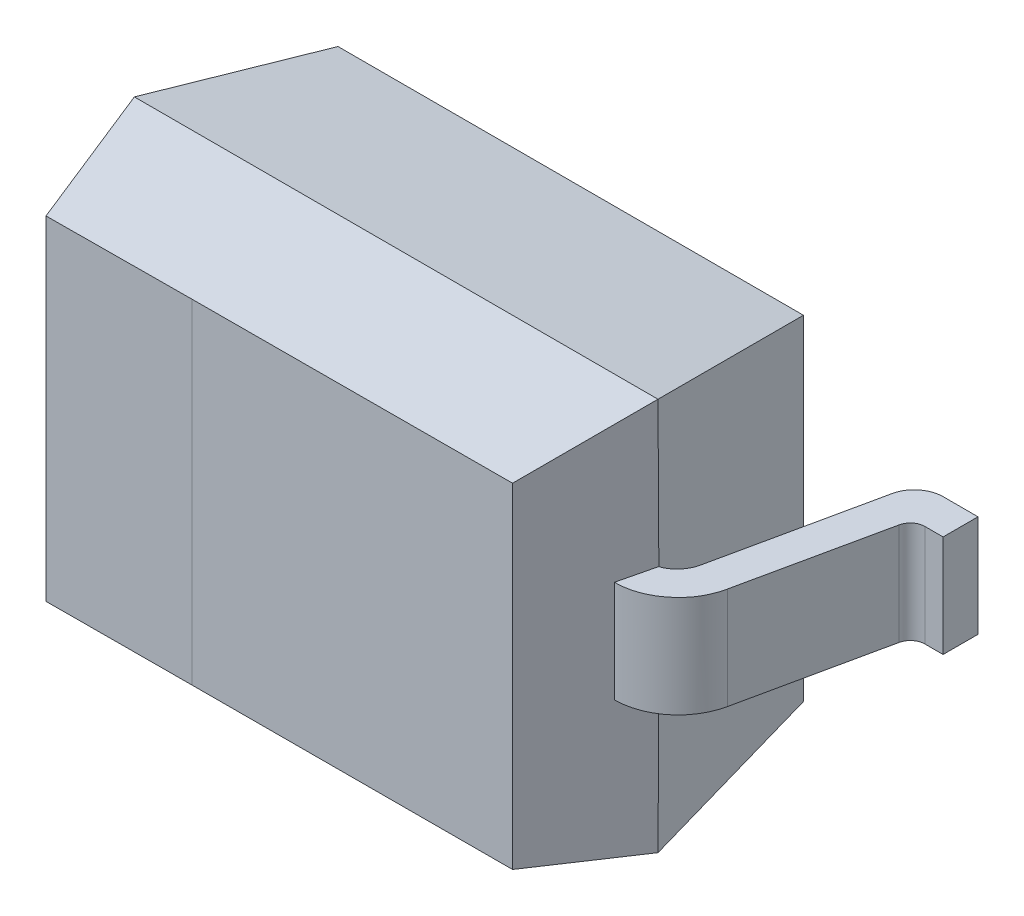
ISO-10303-21;
HEADER;
FILE_DESCRIPTION(('STEP AP214'),'2;1');
FILE_NAME('part.step','',(''),(''),'','','');
FILE_SCHEMA(('AUTOMOTIVE_DESIGN { 1 0 10303 214 1 1 1 1 }'));
ENDSEC;
DATA;
#1=APPLICATION_CONTEXT('core data for automotive mechanical design processes');
#2=APPLICATION_PROTOCOL_DEFINITION('international standard','automotive_design',2000,#1);
#3=PRODUCT_CONTEXT('',#1,'mechanical');
#4=PRODUCT('Part','Part','',(#3));
#5=PRODUCT_RELATED_PRODUCT_CATEGORY('part','',(#4));
#6=PRODUCT_DEFINITION_FORMATION('','',#4);
#7=PRODUCT_DEFINITION_CONTEXT('part definition',#1,'design');
#8=PRODUCT_DEFINITION('design','',#6,#7);
#9=PRODUCT_DEFINITION_SHAPE('','',#8);
#10=(LENGTH_UNIT() NAMED_UNIT(*) SI_UNIT(.MILLI.,.METRE.));
#11=(NAMED_UNIT(*) PLANE_ANGLE_UNIT() SI_UNIT($,.RADIAN.));
#12=(NAMED_UNIT(*) SI_UNIT($,.STERADIAN.) SOLID_ANGLE_UNIT());
#13=UNCERTAINTY_MEASURE_WITH_UNIT(LENGTH_MEASURE(1.E-05),#10,'distance_accuracy_value','');
#14=(GEOMETRIC_REPRESENTATION_CONTEXT(3) GLOBAL_UNCERTAINTY_ASSIGNED_CONTEXT((#13)) GLOBAL_UNIT_ASSIGNED_CONTEXT((#10,
#11,#12)) REPRESENTATION_CONTEXT('',''));
#15=CARTESIAN_POINT('',(0.,0.,0.));
#16=DIRECTION('',(0.,0.,1.));
#17=DIRECTION('',(1.,0.,0.));
#18=AXIS2_PLACEMENT_3D('',#15,#16,#17);
#19=CARTESIAN_POINT('',(0.,-0.543243243287631,-0.0905405405479386));
#20=DIRECTION('',(0.,0.986393923832144,0.164398987305357));
#21=DIRECTION('',(0.,-0.164398987305357,0.986393923832144));
#22=AXIS2_PLACEMENT_3D('',#19,#20,#21);
#23=PLANE('',#22);
#24=DIRECTION('',(1.,0.,0.));
#25=VECTOR('',#24,1.);
#26=CARTESIAN_POINT('',(0.,-0.575000000044477,0.0999999999931353));
#27=LINE('',#26,#25);
#28=CARTESIAN_POINT('',(0.799999999996712,-0.575000000042883,0.0999999999954235));
#29=VERTEX_POINT('',#28);
#30=CARTESIAN_POINT('',(-0.799999999994254,-0.575000000044477,0.0999999999954235));
#31=VERTEX_POINT('',#30);
#32=EDGE_CURVE('E193',#29,#31,#27,.F.);
#33=ORIENTED_EDGE('',*,*,#32,.F.);
#34=DIRECTION('',(-0.16222142136331,0.162221421124477,-0.973328526746865));
#35=VECTOR('',#34,1.);
#36=CARTESIAN_POINT('',(0.900000000150332,-0.67500000005087,0.700000000031497));
#37=LINE('',#36,#35);
#38=CARTESIAN_POINT('',(0.900000000167308,-0.675000000035295,0.700000000057765));
#39=VERTEX_POINT('',#38);
#40=EDGE_CURVE('E197',#39,#29,#37,.T.);
#41=ORIENTED_EDGE('',*,*,#40,.F.);
#42=DIRECTION('',(1.,0.,0.));
#43=VECTOR('',#42,1.);
#44=CARTESIAN_POINT('',(0.,-0.675000000027232,0.700000000025074));
#45=LINE('',#44,#43);
#46=CARTESIAN_POINT('',(-0.900000000136452,-0.675000000034631,0.700000000051428));
#47=VERTEX_POINT('',#46);
#48=EDGE_CURVE('E228',#47,#39,#45,.T.);
#49=ORIENTED_EDGE('',*,*,#48,.F.);
#50=DIRECTION('',(-0.162221421285409,-0.162221421126583,0.973328526759497));
#51=VECTOR('',#50,1.);
#52=CARTESIAN_POINT('',(-0.799999999996712,-0.575000000044876,0.0999999999955346));
#53=LINE('',#52,#51);
#54=EDGE_CURVE('E200',#31,#47,#53,.T.);
#55=ORIENTED_EDGE('',*,*,#54,.F.);
#56=EDGE_LOOP('',(#33,#41,#49,#55));
#57=FACE_BOUND('',#56,.T.);
#58=ADVANCED_FACE('F17',(#57),#23,.F.);
#59=CARTESIAN_POINT('',(-1.180841579,-0.175,0.1));
#60=DIRECTION('',(0.,1.,0.));
#61=DIRECTION('',(0.,0.,1.));
#62=AXIS2_PLACEMENT_3D('',#59,#60,#61);
#63=CYLINDRICAL_SURFACE('',#62,0.0999999996006634);
#64=CARTESIAN_POINT('',(-1.08306133768188,0.175,0.0790470910837952));
#65=CARTESIAN_POINT('',(-1.09038135668443,0.175,0.0448870031683507));
#66=CARTESIAN_POINT('',(-1.11797382468277,0.175,0.0222333914201766));
#67=CARTESIAN_POINT('',(-1.14505445712793,0.175,2.88057883888202E-10));
#68=CARTESIAN_POINT('',(-1.180841579,0.175,1.99668311940716E-10));
#69=B_SPLINE_CURVE_WITH_KNOTS('',2,(#64,#65,#66,#67,#68),.UNSPECIFIED.,.F.,.F.,(3,2,3),(0.,0.5,
1.),.UNSPECIFIED.);
#70=CARTESIAN_POINT('',(-1.08306133762269,0.175,0.0790470910711107));
#71=VERTEX_POINT('',#70);
#72=CARTESIAN_POINT('',(-1.180841579,0.175,1.99668305164453E-10));
#73=VERTEX_POINT('',#72);
#74=EDGE_CURVE('E548',#71,#73,#69,.T.);
#75=ORIENTED_EDGE('',*,*,#74,.F.);
#76=DIRECTION('',(0.,1.,0.));
#77=VECTOR('',#76,1.);
#78=CARTESIAN_POINT('',(-1.08306133713148,0.,0.0790470909658528));
#79=LINE('',#78,#77);
#80=CARTESIAN_POINT('',(-1.0830613376225,-0.175,0.0790470910710698));
#81=VERTEX_POINT('',#80);
#82=EDGE_CURVE('E291',#71,#81,#79,.F.);
#83=ORIENTED_EDGE('',*,*,#82,.T.);
#84=CARTESIAN_POINT('',(-1.180841579,-0.175,0.1));
#85=DIRECTION('',(0.,1.,0.));
#86=DIRECTION('',(0.977802413949725,0.,-0.209529089326732));
#87=AXIS2_PLACEMENT_3D('',#84,#85,#86);
#88=CIRCLE('',#87,0.0999999996006634);
#89=CARTESIAN_POINT('',(-1.180841579,-0.175,1.99473045435386E-10));
#90=VERTEX_POINT('',#89);
#91=EDGE_CURVE('E481',#81,#90,#88,.T.);
#92=ORIENTED_EDGE('',*,*,#91,.T.);
#93=DIRECTION('',(0.,1.,0.));
#94=VECTOR('',#93,1.);
#95=CARTESIAN_POINT('',(-1.180841579,0.,0.));
#96=LINE('',#95,#94);
#97=EDGE_CURVE('E223',#73,#90,#96,.F.);
#98=ORIENTED_EDGE('',*,*,#97,.F.);
#99=EDGE_LOOP('',(#75,#83,#92,#98));
#100=FACE_BOUND('',#99,.T.);
#101=ADVANCED_FACE('F551',(#100),#63,.T.);
#102=CARTESIAN_POINT('',(0.,0.,0.));
#103=DIRECTION('',(0.,0.,-1.));
#104=DIRECTION('',(-1.,0.,0.));
#105=AXIS2_PLACEMENT_3D('',#102,#103,#104);
#106=PLANE('',#105);
#107=DIRECTION('',(1.,0.,0.));
#108=VECTOR('',#107,1.);
#109=CARTESIAN_POINT('',(0.,0.175,1.99668311940716E-10));
#110=LINE('',#109,#108);
#111=CARTESIAN_POINT('',(-1.3,0.175,1.33112207960477E-10));
#112=VERTEX_POINT('',#111);
#113=EDGE_CURVE('E541',#73,#112,#110,.F.);
#114=ORIENTED_EDGE('',*,*,#113,.F.);
#115=ORIENTED_EDGE('',*,*,#97,.T.);
#116=DIRECTION('',(1.,0.,0.));
#117=VECTOR('',#116,1.);
#118=CARTESIAN_POINT('',(0.,-0.175,1.99277792482582E-10));
#119=LINE('',#118,#117);
#120=CARTESIAN_POINT('',(-1.3,-0.175,1.32851861655055E-10));
#121=VERTEX_POINT('',#120);
#122=EDGE_CURVE('E478',#90,#121,#119,.F.);
#123=ORIENTED_EDGE('',*,*,#122,.T.);
#124=DIRECTION('',(0.,1.,0.));
#125=VECTOR('',#124,1.);
#126=CARTESIAN_POINT('',(-1.3,0.,0.));
#127=LINE('',#126,#125);
#128=EDGE_CURVE('E928',#121,#112,#127,.T.);
#129=ORIENTED_EDGE('',*,*,#128,.T.);
#130=EDGE_LOOP('',(#114,#115,#123,#129));
#131=FACE_BOUND('',#130,.T.);
#132=ADVANCED_FACE('F560',(#131),#106,.T.);
#133=CARTESIAN_POINT('',(-1.3,0.,0.));
#134=DIRECTION('',(1.,0.,0.));
#135=DIRECTION('',(0.,0.,-1.));
#136=AXIS2_PLACEMENT_3D('',#133,#134,#135);
#137=PLANE('',#136);
#138=DIRECTION('',(0.,1.,0.));
#139=VECTOR('',#138,1.);
#140=CARTESIAN_POINT('',(-1.3,0.,0.12));
#141=LINE('',#140,#139);
#142=CARTESIAN_POINT('',(-1.3,0.175,0.12));
#143=VERTEX_POINT('',#142);
#144=CARTESIAN_POINT('',(-1.3,-0.175,0.12));
#145=VERTEX_POINT('',#144);
#146=EDGE_CURVE('E931',#143,#145,#141,.F.);
#147=ORIENTED_EDGE('',*,*,#146,.F.);
#148=DIRECTION('',(0.,0.,1.));
#149=VECTOR('',#148,1.);
#150=CARTESIAN_POINT('',(-1.3,0.175,0.));
#151=LINE('',#150,#149);
#152=EDGE_CURVE('E533',#112,#143,#151,.T.);
#153=ORIENTED_EDGE('',*,*,#152,.F.);
#154=ORIENTED_EDGE('',*,*,#128,.F.);
#155=DIRECTION('',(0.,0.,1.));
#156=VECTOR('',#155,1.);
#157=CARTESIAN_POINT('',(-1.3,-0.175,0.));
#158=LINE('',#157,#156);
#159=EDGE_CURVE('E475',#121,#145,#158,.T.);
#160=ORIENTED_EDGE('',*,*,#159,.T.);
#161=EDGE_LOOP('',(#147,#153,#154,#160));
#162=FACE_BOUND('',#161,.T.);
#163=ADVANCED_FACE('F933',(#162),#137,.F.);
#164=CARTESIAN_POINT('',(0.,0.,0.12));
#165=DIRECTION('',(0.,0.,1.));
#166=DIRECTION('',(1.,0.,0.));
#167=AXIS2_PLACEMENT_3D('',#164,#165,#166);
#168=PLANE('',#167);
#169=DIRECTION('',(1.,0.,0.));
#170=VECTOR('',#169,1.);
#171=CARTESIAN_POINT('',(0.,0.175,0.12));
#172=LINE('',#171,#170);
#173=CARTESIAN_POINT('',(-1.23743068399926,0.175,0.120000000434842));
#174=VERTEX_POINT('',#173);
#175=EDGE_CURVE('E540',#143,#174,#172,.T.);
#176=ORIENTED_EDGE('',*,*,#175,.F.);
#177=ORIENTED_EDGE('',*,*,#146,.T.);
#178=DIRECTION('',(1.,0.,0.));
#179=VECTOR('',#178,1.);
#180=CARTESIAN_POINT('',(0.,-0.175,0.12));
#181=LINE('',#180,#179);
#182=CARTESIAN_POINT('',(-1.237430684,-0.175,0.12000000043494));
#183=VERTEX_POINT('',#182);
#184=EDGE_CURVE('E469',#145,#183,#181,.T.);
#185=ORIENTED_EDGE('',*,*,#184,.T.);
#186=DIRECTION('',(0.,1.,0.));
#187=VECTOR('',#186,1.);
#188=CARTESIAN_POINT('',(-1.237430684,-0.175,0.120000000695904));
#189=LINE('',#188,#187);
#190=EDGE_CURVE('E502',#183,#174,#189,.T.);
#191=ORIENTED_EDGE('',*,*,#190,.T.);
#192=EDGE_LOOP('',(#176,#177,#185,#191));
#193=FACE_BOUND('',#192,.T.);
#194=ADVANCED_FACE('F522',(#193),#168,.T.);
#195=CARTESIAN_POINT('',(-1.237430684,-0.175,0.17));
#196=DIRECTION('',(0.,1.,0.));
#197=DIRECTION('',(0.,0.,1.));
#198=AXIS2_PLACEMENT_3D('',#195,#196,#197);
#199=CYLINDRICAL_SURFACE('',#198,0.0499999993040961);
#200=DIRECTION('',(0.,1.,0.));
#201=VECTOR('',#200,1.);
#202=CARTESIAN_POINT('',(-1.18854056314265,0.,0.1595235454453));
#203=LINE('',#202,#201);
#204=CARTESIAN_POINT('',(-1.18854056369605,0.175,0.159523545563886));
#205=VERTEX_POINT('',#204);
#206=CARTESIAN_POINT('',(-1.1885405636963,-0.175,0.159523545563181));
#207=VERTEX_POINT('',#206);
#208=EDGE_CURVE('E467',#205,#207,#203,.F.);
#209=ORIENTED_EDGE('',*,*,#208,.F.);
#210=CARTESIAN_POINT('',(-1.23743068399852,0.175,0.120000000173781));
#211=CARTESIAN_POINT('',(-1.21977256141157,0.175,0.120230859073692));
#212=CARTESIAN_POINT('',(-1.20599680716956,0.175,0.131116695960241));
#213=CARTESIAN_POINT('',(-1.19260438919932,0.175,0.141699613960908));
#214=CARTESIAN_POINT('',(-1.18854056382375,0.175,0.15952354559125));
#215=B_SPLINE_CURVE_WITH_KNOTS('',2,(#210,#211,#212,#213,#214),.UNSPECIFIED.,.F.,.F.,(3,2,3),
(0.,0.5,1.),.UNSPECIFIED.);
#216=EDGE_CURVE('E622',#174,#205,#215,.T.);
#217=ORIENTED_EDGE('',*,*,#216,.F.);
#218=ORIENTED_EDGE('',*,*,#190,.F.);
#219=CARTESIAN_POINT('',(-1.237430684,-0.175,0.17));
#220=DIRECTION('',(0.,-1.,0.));
#221=DIRECTION('',(0.,0.,-1.));
#222=AXIS2_PLACEMENT_3D('',#219,#220,#221);
#223=CIRCLE('',#222,0.0499999993040961);
#224=EDGE_CURVE('E468',#183,#207,#223,.T.);
#225=ORIENTED_EDGE('',*,*,#224,.T.);
#226=EDGE_LOOP('',(#209,#217,#218,#225));
#227=FACE_BOUND('',#226,.T.);
#228=ADVANCED_FACE('F512',(#227),#199,.F.);
#229=CARTESIAN_POINT('',(-1.16904360627857,0.,0.250509344159851));
#230=DIRECTION('',(-0.977802414084727,0.,0.209529088696727));
#231=DIRECTION('',(0.209529088696727,0.,0.977802414084727));
#232=AXIS2_PLACEMENT_3D('',#229,#230,#231);
#233=PLANE('',#232);
#234=DIRECTION('',(0.209529089204493,0.,0.977802413975919));
#235=VECTOR('',#234,1.);
#236=CARTESIAN_POINT('',(-1.18854056382375,0.175,0.15952354559125));
#237=LINE('',#236,#235);
#238=CARTESIAN_POINT('',(-1.0842749520122,0.175,0.646096399502258));
#239=VERTEX_POINT('',#238);
#240=EDGE_CURVE('E493',#205,#239,#237,.T.);
#241=ORIENTED_EDGE('',*,*,#240,.F.);
#242=ORIENTED_EDGE('',*,*,#208,.T.);
#243=DIRECTION('',(0.209529089203184,0.,0.9778024139762));
#244=VECTOR('',#243,1.);
#245=CARTESIAN_POINT('',(-1.18854056382425,-0.175,0.15952354558984));
#246=LINE('',#245,#244);
#247=CARTESIAN_POINT('',(-1.08427495201279,-0.175,0.646096399501579));
#248=VERTEX_POINT('',#247);
#249=EDGE_CURVE('E455',#207,#248,#246,.T.);
#250=ORIENTED_EDGE('',*,*,#249,.T.);
#251=DIRECTION('',(0.,1.,0.));
#252=VECTOR('',#251,1.);
#253=CARTESIAN_POINT('',(-1.08427495200007,-0.175,0.646096399499659));
#254=LINE('',#253,#252);
#255=EDGE_CURVE('E465',#239,#248,#254,.F.);
#256=ORIENTED_EDGE('',*,*,#255,.F.);
#257=EDGE_LOOP('',(#241,#242,#250,#256));
#258=FACE_BOUND('',#257,.T.);
#259=ADVANCED_FACE('F464',(#258),#233,.T.);
#260=CARTESIAN_POINT('',(1.16904360627857,0.,0.250509344159851));
#261=DIRECTION('',(-0.977802414084727,0.,-0.209529088696727));
#262=DIRECTION('',(-0.209529088696727,0.,0.977802414084727));
#263=AXIS2_PLACEMENT_3D('',#260,#261,#262);
#264=PLANE('',#263);
#265=DIRECTION('',(0.,1.,0.));
#266=VECTOR('',#265,1.);
#267=CARTESIAN_POINT('',(1.1885405633136,-0.175,0.159523545481932));
#268=LINE('',#267,#266);
#269=CARTESIAN_POINT('',(1.18854056339856,-0.175,0.159523545500138));
#270=VERTEX_POINT('',#269);
#271=CARTESIAN_POINT('',(1.18854056339881,0.175,0.159523545499433));
#272=VERTEX_POINT('',#271);
#273=EDGE_CURVE('E501',#270,#272,#268,.T.);
#274=ORIENTED_EDGE('',*,*,#273,.T.);
#275=DIRECTION('',(0.209529088421965,0.,-0.977802414143604));
#276=VECTOR('',#275,1.);
#277=CARTESIAN_POINT('',(1.08427495207402,0.175,0.646096399513896));
#278=LINE('',#277,#276);
#279=CARTESIAN_POINT('',(1.08427495208556,0.175,0.646096399517173));
#280=VERTEX_POINT('',#279);
#281=EDGE_CURVE('E852',#280,#272,#278,.T.);
#282=ORIENTED_EDGE('',*,*,#281,.F.);
#283=DIRECTION('',(0.,1.,0.));
#284=VECTOR('',#283,1.);
#285=CARTESIAN_POINT('',(1.0842749520971,-0.175,0.64609639952045));
#286=LINE('',#285,#284);
#287=CARTESIAN_POINT('',(1.08427495208498,-0.175,0.646096399517852));
#288=VERTEX_POINT('',#287);
#289=EDGE_CURVE('E861',#288,#280,#286,.T.);
#290=ORIENTED_EDGE('',*,*,#289,.F.);
#291=DIRECTION('',(0.209529088423273,0.,-0.977802414143324));
#292=VECTOR('',#291,1.);
#293=CARTESIAN_POINT('',(1.08427495207285,-0.175,0.646096399515253));
#294=LINE('',#293,#292);
#295=EDGE_CURVE('E894',#288,#270,#294,.T.);
#296=ORIENTED_EDGE('',*,*,#295,.T.);
#297=EDGE_LOOP('',(#274,#282,#290,#296));
#298=FACE_BOUND('',#297,.T.);
#299=ADVANCED_FACE('F859',(#298),#264,.F.);
#300=CARTESIAN_POINT('',(1.237430684,-0.175,0.17));
#301=DIRECTION('',(0.,1.,0.));
#302=DIRECTION('',(0.,0.,1.));
#303=AXIS2_PLACEMENT_3D('',#300,#301,#302);
#304=CYLINDRICAL_SURFACE('',#303,0.05);
#305=DIRECTION('',(0.,1.,0.));
#306=VECTOR('',#305,1.);
#307=CARTESIAN_POINT('',(1.237430684,0.,0.12));
#308=LINE('',#307,#306);
#309=CARTESIAN_POINT('',(1.237430684,0.175,0.12));
#310=VERTEX_POINT('',#309);
#311=CARTESIAN_POINT('',(1.23743068399926,-0.175,0.119999999999903));
#312=VERTEX_POINT('',#311);
#313=EDGE_CURVE('E1320',#310,#312,#308,.F.);
#314=ORIENTED_EDGE('',*,*,#313,.F.);
#315=CARTESIAN_POINT('',(1.18854056348402,0.175,0.159523545516934));
#316=CARTESIAN_POINT('',(1.19246618799484,0.175,0.142305761982645));
#317=CARTESIAN_POINT('',(1.20599680682896,0.175,0.131116695585501));
#318=CARTESIAN_POINT('',(1.2191509107451,0.175,0.120238986005694));
#319=CARTESIAN_POINT('',(1.237430684,0.175,0.12));
#320=B_SPLINE_CURVE_WITH_KNOTS('',2,(#315,#316,#317,#318,#319),.UNSPECIFIED.,.F.,.F.,(3,2,3),
(0.,0.5,1.),.UNSPECIFIED.);
#321=EDGE_CURVE('E863',#272,#310,#320,.T.);
#322=ORIENTED_EDGE('',*,*,#321,.F.);
#323=ORIENTED_EDGE('',*,*,#273,.F.);
#324=CARTESIAN_POINT('',(1.237430684,-0.175,0.17));
#325=DIRECTION('',(0.,-1.,0.));
#326=DIRECTION('',(-0.977802413728021,0.,-0.209529090361355));
#327=AXIS2_PLACEMENT_3D('',#324,#325,#326);
#328=CIRCLE('',#327,0.0499999999999999);
#329=EDGE_CURVE('E1304',#270,#312,#328,.T.);
#330=ORIENTED_EDGE('',*,*,#329,.T.);
#331=EDGE_LOOP('',(#314,#322,#323,#330));
#332=FACE_BOUND('',#331,.T.);
#333=ADVANCED_FACE('F1164',(#332),#304,.F.);
#334=CARTESIAN_POINT('',(0.,0.,0.12));
#335=DIRECTION('',(0.,0.,1.));
#336=DIRECTION('',(1.,0.,0.));
#337=AXIS2_PLACEMENT_3D('',#334,#335,#336);
#338=PLANE('',#337);
#339=DIRECTION('',(1.,0.,0.));
#340=VECTOR('',#339,1.);
#341=CARTESIAN_POINT('',(0.,0.175,0.12));
#342=LINE('',#341,#340);
#343=CARTESIAN_POINT('',(1.3,0.175,0.12));
#344=VERTEX_POINT('',#343);
#345=EDGE_CURVE('E865',#310,#344,#342,.T.);
#346=ORIENTED_EDGE('',*,*,#345,.F.);
#347=ORIENTED_EDGE('',*,*,#313,.T.);
#348=DIRECTION('',(1.,0.,0.));
#349=VECTOR('',#348,1.);
#350=CARTESIAN_POINT('',(0.,-0.175,0.119999999999805));
#351=LINE('',#350,#349);
#352=CARTESIAN_POINT('',(1.3,-0.175,0.11999999999987));
#353=VERTEX_POINT('',#352);
#354=EDGE_CURVE('E1295',#312,#353,#351,.T.);
#355=ORIENTED_EDGE('',*,*,#354,.T.);
#356=DIRECTION('',(0.,1.,0.));
#357=VECTOR('',#356,1.);
#358=CARTESIAN_POINT('',(1.3,0.,0.12));
#359=LINE('',#358,#357);
#360=EDGE_CURVE('E1365',#344,#353,#359,.F.);
#361=ORIENTED_EDGE('',*,*,#360,.F.);
#362=EDGE_LOOP('',(#346,#347,#355,#361));
#363=FACE_BOUND('',#362,.T.);
#364=ADVANCED_FACE('F1172',(#363),#338,.T.);
#365=CARTESIAN_POINT('',(1.3,0.,0.));
#366=DIRECTION('',(1.,0.,0.));
#367=DIRECTION('',(0.,0.,-1.));
#368=AXIS2_PLACEMENT_3D('',#365,#366,#367);
#369=PLANE('',#368);
#370=DIRECTION('',(0.,0.,1.));
#371=VECTOR('',#370,1.);
#372=CARTESIAN_POINT('',(1.3,0.175,0.));
#373=LINE('',#372,#371);
#374=CARTESIAN_POINT('',(1.3,0.175,0.));
#375=VERTEX_POINT('',#374);
#376=EDGE_CURVE('E873',#344,#375,#373,.F.);
#377=ORIENTED_EDGE('',*,*,#376,.F.);
#378=ORIENTED_EDGE('',*,*,#360,.T.);
#379=DIRECTION('',(0.,0.,1.));
#380=VECTOR('',#379,1.);
#381=CARTESIAN_POINT('',(1.3,-0.175,0.));
#382=LINE('',#381,#380);
#383=CARTESIAN_POINT('',(1.3,-0.175,0.));
#384=VERTEX_POINT('',#383);
#385=EDGE_CURVE('E1293',#353,#384,#382,.F.);
#386=ORIENTED_EDGE('',*,*,#385,.T.);
#387=DIRECTION('',(0.,1.,0.));
#388=VECTOR('',#387,1.);
#389=CARTESIAN_POINT('',(1.3,0.,0.));
#390=LINE('',#389,#388);
#391=EDGE_CURVE('E1292',#375,#384,#390,.F.);
#392=ORIENTED_EDGE('',*,*,#391,.F.);
#393=EDGE_LOOP('',(#377,#378,#386,#392));
#394=FACE_BOUND('',#393,.T.);
#395=ADVANCED_FACE('F1182',(#394),#369,.T.);
#396=CARTESIAN_POINT('',(0.,0.,0.));
#397=DIRECTION('',(0.,0.,-1.));
#398=DIRECTION('',(-1.,0.,0.));
#399=AXIS2_PLACEMENT_3D('',#396,#397,#398);
#400=PLANE('',#399);
#401=DIRECTION('',(1.,0.,0.));
#402=VECTOR('',#401,1.);
#403=CARTESIAN_POINT('',(0.,0.175,0.));
#404=LINE('',#403,#402);
#405=CARTESIAN_POINT('',(1.180841579,0.175,-1.95259729066956E-13));
#406=VERTEX_POINT('',#405);
#407=EDGE_CURVE('E876',#375,#406,#404,.F.);
#408=ORIENTED_EDGE('',*,*,#407,.F.);
#409=ORIENTED_EDGE('',*,*,#391,.T.);
#410=DIRECTION('',(1.,0.,0.));
#411=VECTOR('',#410,1.);
#412=CARTESIAN_POINT('',(0.,-0.175,0.));
#413=LINE('',#412,#411);
#414=CARTESIAN_POINT('',(1.180841579,-0.175,0.));
#415=VERTEX_POINT('',#414);
#416=EDGE_CURVE('E1288',#384,#415,#413,.F.);
#417=ORIENTED_EDGE('',*,*,#416,.T.);
#418=DIRECTION('',(0.,1.,0.));
#419=VECTOR('',#418,1.);
#420=CARTESIAN_POINT('',(1.180841579,-0.175,0.));
#421=LINE('',#420,#419);
#422=EDGE_CURVE('E1290',#406,#415,#421,.F.);
#423=ORIENTED_EDGE('',*,*,#422,.F.);
#424=EDGE_LOOP('',(#408,#409,#417,#423));
#425=FACE_BOUND('',#424,.T.);
#426=ADVANCED_FACE('F1192',(#425),#400,.T.);
#427=CARTESIAN_POINT('',(1.180841579,-0.175,0.1));
#428=DIRECTION('',(0.,1.,0.));
#429=DIRECTION('',(0.,0.,1.));
#430=AXIS2_PLACEMENT_3D('',#427,#428,#429);
#431=CYLINDRICAL_SURFACE('',#430,0.1);
#432=CARTESIAN_POINT('',(1.180841579,0.175,-3.90519458133912E-13));
#433=CARTESIAN_POINT('',(1.14590600552078,0.175,-3.90519458133912E-13));
#434=CARTESIAN_POINT('',(1.11797382451398,0.175,0.0222333911833043));
#435=CARTESIAN_POINT('',(1.09055978067866,0.175,0.0440543567702465));
#436=CARTESIAN_POINT('',(1.08306133758388,0.175,0.0790470910627953));
#437=B_SPLINE_CURVE_WITH_KNOTS('',2,(#432,#433,#434,#435,#436),.UNSPECIFIED.,.F.,.F.,(3,2,3),
(0.,0.5,1.),.UNSPECIFIED.);
#438=CARTESIAN_POINT('',(1.08306133747607,0.175,0.0790470910396927));
#439=VERTEX_POINT('',#438);
#440=EDGE_CURVE('E878',#406,#439,#437,.T.);
#441=ORIENTED_EDGE('',*,*,#440,.F.);
#442=ORIENTED_EDGE('',*,*,#422,.T.);
#443=CARTESIAN_POINT('',(1.180841579,-0.175,0.1));
#444=DIRECTION('',(0.,1.,0.));
#445=DIRECTION('',(0.,0.,-1.));
#446=AXIS2_PLACEMENT_3D('',#443,#444,#445);
#447=CIRCLE('',#446,0.1);
#448=CARTESIAN_POINT('',(1.08306133747626,-0.175,0.0790470910397336));
#449=VERTEX_POINT('',#448);
#450=EDGE_CURVE('E890',#415,#449,#447,.T.);
#451=ORIENTED_EDGE('',*,*,#450,.T.);
#452=DIRECTION('',(0.,1.,0.));
#453=VECTOR('',#452,1.);
#454=CARTESIAN_POINT('',(1.08306133713148,0.,0.0790470909658529));
#455=LINE('',#454,#453);
#456=EDGE_CURVE('E460',#439,#449,#455,.F.);
#457=ORIENTED_EDGE('',*,*,#456,.F.);
#458=EDGE_LOOP('',(#441,#442,#451,#457));
#459=FACE_BOUND('',#458,.T.);
#460=ADVANCED_FACE('F324',(#459),#431,.T.);
#461=CARTESIAN_POINT('',(0.,-0.800000000024254,0.199999999985448));
#462=DIRECTION('',(0.,-0.970142500151214,0.242535625012804));
#463=DIRECTION('',(0.,-0.242535625012804,-0.970142500151214));
#464=AXIS2_PLACEMENT_3D('',#461,#462,#463);
#465=PLANE('',#464);
#466=ORIENTED_EDGE('',*,*,#48,.T.);
#467=DIRECTION('',(-0.235702260745067,0.235702260352088,0.942809041505533));
#468=VECTOR('',#467,1.);
#469=CARTESIAN_POINT('',(0.900000000150332,-0.675000000025645,0.700000000031421));
#470=LINE('',#469,#468);
#471=CARTESIAN_POINT('',(0.800000000305592,-0.575000000042505,1.10000000002737));
#472=VERTEX_POINT('',#471);
#473=EDGE_CURVE('E284',#39,#472,#470,.T.);
#474=ORIENTED_EDGE('',*,*,#473,.T.);
#475=CARTESIAN_POINT('',(0.800000000407456,-0.57500000004367,1.10000000000055));
#476=DIRECTION('',(-0.999999990505225,3.34220343471773E-05,0.000133688137402508));
#477=VECTOR('',#476,1.);
#478=LINE('',#475,#477);
#479=CARTESIAN_POINT('',(-0.299999999994327,-0.574470627649863,1.10243267116188));
#480=VERTEX_POINT('',#479);
#481=EDGE_CURVE('E295',#472,#480,#478,.T.);
#482=ORIENTED_EDGE('',*,*,#481,.T.);
#483=CARTESIAN_POINT('',(-0.299999999978612,-0.574375000890944,1.10249999661171));
#484=DIRECTION('',(-0.999986652332322,0.00125311745825155,0.00501246983352224));
#485=VECTOR('',#484,1.);
#486=LINE('',#483,#485);
#487=CARTESIAN_POINT('',(-0.798750000739118,-0.573750000315081,1.10499999949849));
#488=VERTEX_POINT('',#487);
#489=EDGE_CURVE('E229',#480,#488,#486,.T.);
#490=ORIENTED_EDGE('',*,*,#489,.T.);
#491=DIRECTION('',(-0.23570225927309,-0.235702260438675,-0.94280904185188));
#492=VECTOR('',#491,1.);
#493=CARTESIAN_POINT('',(-0.798750000788231,-0.573750000215326,1.10499999931444));
#494=LINE('',#493,#492);
#495=EDGE_CURVE('E226',#488,#47,#494,.T.);
#496=ORIENTED_EDGE('',*,*,#495,.T.);
#497=EDGE_LOOP('',(#466,#474,#482,#490,#496));
#498=FACE_BOUND('',#497,.T.);
#499=ADVANCED_FACE('F313',(#498),#465,.T.);
#500=CARTESIAN_POINT('',(-1.05170731659023,0.,0.225365853516636));
#501=DIRECTION('',(-0.977802414084727,0.,0.209529088696727));
#502=DIRECTION('',(0.209529088696727,0.,0.977802414084727));
#503=AXIS2_PLACEMENT_3D('',#500,#501,#502);
#504=PLANE('',#503);
#505=ORIENTED_EDGE('',*,*,#82,.F.);
#506=DIRECTION('',(-0.209529088790663,0.,-0.977802414064597));
#507=VECTOR('',#506,1.);
#508=CARTESIAN_POINT('',(-0.9669386624025,0.175,0.6209529088925));
#509=LINE('',#508,#507);
#510=CARTESIAN_POINT('',(-0.966938662402073,0.175,0.620952908892409));
#511=VERTEX_POINT('',#510);
#512=EDGE_CURVE('E574',#511,#71,#509,.T.);
#513=ORIENTED_EDGE('',*,*,#512,.F.);
#514=DIRECTION('',(0.,1.,0.));
#515=VECTOR('',#514,1.);
#516=CARTESIAN_POINT('',(-0.966938662401646,-0.175,0.620952908892317));
#517=LINE('',#516,#515);
#518=CARTESIAN_POINT('',(-0.966938662401746,-0.175,0.620952908893345));
#519=VERTEX_POINT('',#518);
#520=EDGE_CURVE('E662',#511,#519,#517,.F.);
#521=ORIENTED_EDGE('',*,*,#520,.T.);
#522=DIRECTION('',(-0.209529088790413,0.,-0.977802414064651));
#523=VECTOR('',#522,1.);
#524=CARTESIAN_POINT('',(-0.966938662401846,-0.175,0.620952908894372));
#525=LINE('',#524,#523);
#526=EDGE_CURVE('E484',#519,#81,#525,.T.);
#527=ORIENTED_EDGE('',*,*,#526,.T.);
#528=EDGE_LOOP('',(#505,#513,#521,#527));
#529=FACE_BOUND('',#528,.T.);
#530=ADVANCED_FACE('F323',(#529),#504,.F.);
#531=CARTESIAN_POINT('',(0.,0.175,0.));
#532=DIRECTION('',(0.,1.,0.));
#533=DIRECTION('',(0.,0.,1.));
#534=AXIS2_PLACEMENT_3D('',#531,#532,#533);
#535=PLANE('',#534);
#536=CARTESIAN_POINT('',(-0.900524305829081,0.175,0.697902778373917));
#537=DIRECTION('',(0.242535625012804,0.,0.970142500151214));
#538=VECTOR('',#537,1.);
#539=LINE('',#536,#538);
#540=CARTESIAN_POINT('',(-0.899637516853218,0.175000153487832,0.696735226489937));
#541=VERTEX_POINT('',#540);
#542=CARTESIAN_POINT('',(-0.87000040311052,0.175,0.819998388952546));
#543=VERTEX_POINT('',#542);
#544=EDGE_CURVE('E397',#541,#543,#539,.T.);
#545=ORIENTED_EDGE('',*,*,#544,.F.);
#546=CARTESIAN_POINT('',(-0.899644475783107,0.175,0.697676386110803));
#547=CARTESIAN_POINT('',(-0.924861100423481,0.175,0.688691198998423));
#548=CARTESIAN_POINT('',(-0.943212663955049,0.175,0.668000141628979));
#549=CARTESIAN_POINT('',(-0.96120383964659,0.175,0.647715415058566));
#550=CARTESIAN_POINT('',(-0.9669386624025,0.175,0.6209529088925));
#551=B_SPLINE_CURVE_WITH_KNOTS('',2,(#546,#547,#548,#549,#550),.UNSPECIFIED.,.F.,.F.,(3,2,3),
(0.,0.5,1.),.UNSPECIFIED.);
#552=EDGE_CURVE('E669',#541,#511,#551,.T.);
#553=ORIENTED_EDGE('',*,*,#552,.T.);
#554=ORIENTED_EDGE('',*,*,#512,.T.);
#555=ORIENTED_EDGE('',*,*,#74,.T.);
#556=ORIENTED_EDGE('',*,*,#113,.T.);
#557=ORIENTED_EDGE('',*,*,#152,.T.);
#558=ORIENTED_EDGE('',*,*,#175,.T.);
#559=ORIENTED_EDGE('',*,*,#216,.T.);
#560=ORIENTED_EDGE('',*,*,#240,.T.);
#561=CARTESIAN_POINT('',(-0.869158421,0.175,0.6));
#562=DIRECTION('',(0.,-1.,0.));
#563=DIRECTION('',(-0.00382719166044934,0.,0.999992676275179));
#564=AXIS2_PLACEMENT_3D('',#561,#562,#563);
#565=CIRCLE('',#564,0.219999999900767);
#566=EDGE_CURVE('E490',#543,#239,#565,.T.);
#567=ORIENTED_EDGE('',*,*,#566,.F.);
#568=EDGE_LOOP('',(#545,#553,#554,#555,#556,#557,#558,#559,#560,#567));
#569=FACE_BOUND('',#568,.T.);
#570=ADVANCED_FACE('F588',(#569),#535,.T.);
#571=CARTESIAN_POINT('',(-0.869158421,-0.175,0.6));
#572=DIRECTION('',(0.,1.,0.));
#573=DIRECTION('',(0.,0.,1.));
#574=AXIS2_PLACEMENT_3D('',#571,#572,#573);
#575=CYLINDRICAL_SURFACE('',#574,0.219999999900767);
#576=ORIENTED_EDGE('',*,*,#566,.T.);
#577=ORIENTED_EDGE('',*,*,#255,.T.);
#578=CARTESIAN_POINT('',(-0.869158421,-0.175,0.6));
#579=DIRECTION('',(0.,1.,0.));
#580=DIRECTION('',(-0.977802414077742,0.,0.209529088729323));
#581=AXIS2_PLACEMENT_3D('',#578,#579,#580);
#582=CIRCLE('',#581,0.219999999900767);
#583=CARTESIAN_POINT('',(-0.870000403055084,-0.175,0.819998388952758));
#584=VERTEX_POINT('',#583);
#585=EDGE_CURVE('E453',#248,#584,#582,.T.);
#586=ORIENTED_EDGE('',*,*,#585,.T.);
#587=DIRECTION('',(0.,1.,0.));
#588=VECTOR('',#587,1.);
#589=CARTESIAN_POINT('',(-0.870000403166283,0.,0.819998389037696));
#590=LINE('',#589,#588);
#591=EDGE_CURVE('E389',#543,#584,#590,.F.);
#592=ORIENTED_EDGE('',*,*,#591,.F.);
#593=EDGE_LOOP('',(#576,#577,#586,#592));
#594=FACE_BOUND('',#593,.T.);
#595=ADVANCED_FACE('F421',(#594),#575,.T.);
#596=CARTESIAN_POINT('',(0.,-0.175,0.));
#597=DIRECTION('',(0.,1.,0.));
#598=DIRECTION('',(0.,0.,1.));
#599=AXIS2_PLACEMENT_3D('',#596,#597,#598);
#600=PLANE('',#599);
#601=ORIENTED_EDGE('',*,*,#249,.F.);
#602=ORIENTED_EDGE('',*,*,#224,.F.);
#603=ORIENTED_EDGE('',*,*,#184,.F.);
#604=ORIENTED_EDGE('',*,*,#159,.F.);
#605=ORIENTED_EDGE('',*,*,#122,.F.);
#606=ORIENTED_EDGE('',*,*,#91,.F.);
#607=ORIENTED_EDGE('',*,*,#526,.F.);
#608=CARTESIAN_POINT('',(-0.966938662401846,-0.175,0.620952908894372));
#609=CARTESIAN_POINT('',(-0.961203839645635,-0.175,0.647715415059825));
#610=CARTESIAN_POINT('',(-0.943212663954321,-0.175,0.668000141629691));
#611=CARTESIAN_POINT('',(-0.924861100422985,-0.175,0.688691198998576));
#612=CARTESIAN_POINT('',(-0.899644475783107,-0.175,0.697676386110804));
#613=B_SPLINE_CURVE_WITH_KNOTS('',2,(#608,#609,#610,#611,#612),.UNSPECIFIED.,.F.,.F.,(3,2,3),
(0.,0.5,1.),.UNSPECIFIED.);
#614=CARTESIAN_POINT('',(-0.899637664734612,-0.174999999999283,0.69673413628356));
#615=VERTEX_POINT('',#614);
#616=EDGE_CURVE('E658',#519,#615,#613,.T.);
#617=ORIENTED_EDGE('',*,*,#616,.T.);
#618=CARTESIAN_POINT('',(-0.870000403166283,-0.175,0.819998389037696));
#619=DIRECTION('',(-0.242535625012804,0.,-0.970142500151214));
#620=VECTOR('',#619,1.);
#621=LINE('',#618,#620);
#622=EDGE_CURVE('E396',#584,#615,#621,.T.);
#623=ORIENTED_EDGE('',*,*,#622,.F.);
#624=ORIENTED_EDGE('',*,*,#585,.F.);
#625=EDGE_LOOP('',(#601,#602,#603,#604,#605,#606,#607,#617,#623,#624));
#626=FACE_BOUND('',#625,.T.);
#627=ADVANCED_FACE('F410',(#626),#600,.F.);
#628=CARTESIAN_POINT('',(1.05170731659023,0.,0.225365853516636));
#629=DIRECTION('',(-0.977802414084727,0.,-0.209529088696727));
#630=DIRECTION('',(-0.209529088696727,0.,0.977802414084727));
#631=AXIS2_PLACEMENT_3D('',#628,#629,#630);
#632=PLANE('',#631);
#633=DIRECTION('',(-0.209529088634651,0.,0.977802414098029));
#634=VECTOR('',#633,1.);
#635=CARTESIAN_POINT('',(1.08306133758388,0.175,0.0790470910627953));
#636=LINE('',#635,#634);
#637=CARTESIAN_POINT('',(0.966938662384804,0.175,0.620952908889714));
#638=VERTEX_POINT('',#637);
#639=EDGE_CURVE('E856',#439,#638,#636,.T.);
#640=ORIENTED_EDGE('',*,*,#639,.F.);
#641=ORIENTED_EDGE('',*,*,#456,.T.);
#642=DIRECTION('',(-0.2095290886349,0.,0.977802414097975));
#643=VECTOR('',#642,1.);
#644=CARTESIAN_POINT('',(1.08306133758426,-0.175,0.0790470910628771));
#645=LINE('',#644,#643);
#646=CARTESIAN_POINT('',(0.966938662385131,-0.175,0.620952908888778));
#647=VERTEX_POINT('',#646);
#648=EDGE_CURVE('E899',#449,#647,#645,.T.);
#649=ORIENTED_EDGE('',*,*,#648,.T.);
#650=DIRECTION('',(0.,1.,0.));
#651=VECTOR('',#650,1.);
#652=CARTESIAN_POINT('',(0.966938662379056,-0.175,0.620952908887477));
#653=LINE('',#652,#651);
#654=EDGE_CURVE('E898',#647,#638,#653,.T.);
#655=ORIENTED_EDGE('',*,*,#654,.T.);
#656=EDGE_LOOP('',(#640,#641,#649,#655));
#657=FACE_BOUND('',#656,.T.);
#658=ADVANCED_FACE('F420',(#657),#632,.T.);
#659=CARTESIAN_POINT('',(0.,-0.175,0.));
#660=DIRECTION('',(0.,1.,0.));
#661=DIRECTION('',(0.,0.,1.));
#662=AXIS2_PLACEMENT_3D('',#659,#660,#661);
#663=PLANE('',#662);
#664=ORIENTED_EDGE('',*,*,#648,.F.);
#665=ORIENTED_EDGE('',*,*,#450,.F.);
#666=ORIENTED_EDGE('',*,*,#416,.F.);
#667=ORIENTED_EDGE('',*,*,#385,.F.);
#668=ORIENTED_EDGE('',*,*,#354,.F.);
#669=ORIENTED_EDGE('',*,*,#329,.F.);
#670=ORIENTED_EDGE('',*,*,#295,.F.);
#671=CARTESIAN_POINT('',(0.869158421,-0.175,0.6));
#672=DIRECTION('',(0.,1.,0.));
#673=DIRECTION('',(0.00382719154585021,0.,0.999992676275617));
#674=AXIS2_PLACEMENT_3D('',#671,#672,#673);
#675=CIRCLE('',#674,0.22);
#676=CARTESIAN_POINT('',(0.870000403085688,-0.175,0.819998389051874));
#677=VERTEX_POINT('',#676);
#678=EDGE_CURVE('E866',#677,#288,#675,.T.);
#679=ORIENTED_EDGE('',*,*,#678,.F.);
#680=CARTESIAN_POINT('',(0.900524305831592,-0.175,0.697902778363873));
#681=DIRECTION('',(-0.242535625012804,0.,0.970142500151214));
#682=VECTOR('',#681,1.);
#683=LINE('',#680,#682);
#684=CARTESIAN_POINT('',(0.899637516850835,-0.175000153487816,0.696735226474038));
#685=VERTEX_POINT('',#684);
#686=EDGE_CURVE('E801',#685,#677,#683,.T.);
#687=ORIENTED_EDGE('',*,*,#686,.F.);
#688=CARTESIAN_POINT('',(0.899644475780177,-0.175,0.697676386099615));
#689=CARTESIAN_POINT('',(0.925447111370983,-0.175,0.688482391572677));
#690=CARTESIAN_POINT('',(0.943212663942117,-0.175,0.668000141616819));
#691=CARTESIAN_POINT('',(0.961334084813796,-0.175,0.64710760419853));
#692=CARTESIAN_POINT('',(0.966938662391205,-0.175,0.62095290889008));
#693=B_SPLINE_CURVE_WITH_KNOTS('',2,(#688,#689,#690,#691,#692),.UNSPECIFIED.,.F.,.F.,(3,2,3),
(0.,0.5,1.),.UNSPECIFIED.);
#694=EDGE_CURVE('E725',#685,#647,#693,.T.);
#695=ORIENTED_EDGE('',*,*,#694,.T.);
#696=EDGE_LOOP('',(#664,#665,#666,#667,#668,#669,#670,#679,#687,#695));
#697=FACE_BOUND('',#696,.T.);
#698=ADVANCED_FACE('F972',(#697),#663,.F.);
#699=CARTESIAN_POINT('',(0.869158421,-0.175,0.6));
#700=DIRECTION('',(0.,1.,0.));
#701=DIRECTION('',(0.,0.,1.));
#702=AXIS2_PLACEMENT_3D('',#699,#700,#701);
#703=CYLINDRICAL_SURFACE('',#702,0.22);
#704=CARTESIAN_POINT('',(0.870000402864,0.175,0.819998389067661));
#705=CARTESIAN_POINT('',(0.947067242654935,0.175,0.819703437322499));
#706=CARTESIAN_POINT('',(1.00779461863849,0.175,0.770821558152302));
#707=CARTESIAN_POINT('',(1.06791877279265,0.175,0.722425236213915));
#708=CARTESIAN_POINT('',(1.08427495207402,0.175,0.646096399513896));
#709=B_SPLINE_CURVE_WITH_KNOTS('',2,(#704,#705,#706,#707,#708),.UNSPECIFIED.,.F.,.F.,(3,2,3),
(0.,0.5,1.),.UNSPECIFIED.);
#710=CARTESIAN_POINT('',(0.870000403030252,0.175,0.819998389052086));
#711=VERTEX_POINT('',#710);
#712=EDGE_CURVE('E850',#711,#280,#709,.T.);
#713=ORIENTED_EDGE('',*,*,#712,.F.);
#714=DIRECTION('',(0.,1.,0.));
#715=VECTOR('',#714,1.);
#716=CARTESIAN_POINT('',(0.870000403141451,0.,0.819998389137024));
#717=LINE('',#716,#715);
#718=EDGE_CURVE('E794',#677,#711,#717,.T.);
#719=ORIENTED_EDGE('',*,*,#718,.F.);
#720=ORIENTED_EDGE('',*,*,#678,.T.);
#721=ORIENTED_EDGE('',*,*,#289,.T.);
#722=EDGE_LOOP('',(#713,#719,#720,#721));
#723=FACE_BOUND('',#722,.T.);
#724=ADVANCED_FACE('F822',(#723),#703,.T.);
#725=CARTESIAN_POINT('',(0.,0.175,0.));
#726=DIRECTION('',(0.,1.,0.));
#727=DIRECTION('',(0.,0.,1.));
#728=AXIS2_PLACEMENT_3D('',#725,#726,#727);
#729=PLANE('',#728);
#730=CARTESIAN_POINT('',(0.870000403141451,0.175,0.819998389137024));
#731=DIRECTION('',(0.242535625012804,0.,-0.970142500151214));
#732=VECTOR('',#731,1.);
#733=LINE('',#730,#732);
#734=CARTESIAN_POINT('',(0.899637664732225,0.174999999999568,0.696734136267698));
#735=VERTEX_POINT('',#734);
#736=EDGE_CURVE('E751',#711,#735,#733,.T.);
#737=ORIENTED_EDGE('',*,*,#736,.F.);
#738=ORIENTED_EDGE('',*,*,#712,.T.);
#739=ORIENTED_EDGE('',*,*,#281,.T.);
#740=ORIENTED_EDGE('',*,*,#321,.T.);
#741=ORIENTED_EDGE('',*,*,#345,.T.);
#742=ORIENTED_EDGE('',*,*,#376,.T.);
#743=ORIENTED_EDGE('',*,*,#407,.T.);
#744=ORIENTED_EDGE('',*,*,#440,.T.);
#745=ORIENTED_EDGE('',*,*,#639,.T.);
#746=CARTESIAN_POINT('',(0.966938662390551,0.175,0.620952908891951));
#747=CARTESIAN_POINT('',(0.961334084812846,0.175,0.647107604199812));
#748=CARTESIAN_POINT('',(0.943212663941389,0.175,0.66800014161753));
#749=CARTESIAN_POINT('',(0.925447111370466,0.175,0.688482391572835));
#750=CARTESIAN_POINT('',(0.899644475780177,0.175,0.697676386099615));
#751=B_SPLINE_CURVE_WITH_KNOTS('',2,(#746,#747,#748,#749,#750),.UNSPECIFIED.,.F.,.F.,(3,2,3),
(0.,0.5,1.),.UNSPECIFIED.);
#752=EDGE_CURVE('E902',#638,#735,#751,.T.);
#753=ORIENTED_EDGE('',*,*,#752,.T.);
#754=EDGE_LOOP('',(#737,#738,#739,#740,#741,#742,#743,#744,#745,#753));
#755=FACE_BOUND('',#754,.T.);
#756=ADVANCED_FACE('F813',(#755),#729,.T.);
#757=CARTESIAN_POINT('',(0.,0.,1.1));
#758=DIRECTION('',(0.,0.,-1.));
#759=DIRECTION('',(-1.,0.,0.));
#760=AXIS2_PLACEMENT_3D('',#757,#758,#759);
#761=PLANE('',#760);
#762=DIRECTION('',(0.,1.,0.));
#763=VECTOR('',#762,1.);
#764=CARTESIAN_POINT('',(0.800000000407455,0.,1.10000000010187));
#765=LINE('',#764,#763);
#766=CARTESIAN_POINT('',(0.800000000203729,0.57500000002493,1.1000000000466));
#767=VERTEX_POINT('',#766);
#768=EDGE_CURVE('E748',#767,#472,#765,.F.);
#769=ORIENTED_EDGE('',*,*,#768,.F.);
#770=CARTESIAN_POINT('',(0.80000000013582,0.57500000003324,1.1));
#771=DIRECTION('',(-0.999999838585193,-0.000568180946745256,0.));
#772=VECTOR('',#771,1.);
#773=LINE('',#770,#772);
#774=CARTESIAN_POINT('',(-0.300000710540036,0.574375003149453,1.10249999991905));
#775=VERTEX_POINT('',#774);
#776=EDGE_CURVE('E744',#767,#775,#773,.T.);
#777=ORIENTED_EDGE('',*,*,#776,.T.);
#778=CARTESIAN_POINT('',(-0.3,-0.574375007992883,1.105));
#779=DIRECTION('',(0.,1.,0.));
#780=VECTOR('',#779,1.);
#781=LINE('',#778,#780);
#782=EDGE_CURVE('E280',#480,#775,#781,.T.);
#783=ORIENTED_EDGE('',*,*,#782,.F.);
#784=ORIENTED_EDGE('',*,*,#481,.F.);
#785=EDGE_LOOP('',(#769,#777,#783,#784));
#786=FACE_BOUND('',#785,.T.);
#787=ADVANCED_FACE('F252',(#786),#761,.F.);
#788=CARTESIAN_POINT('',(0.,0.,1.105));
#789=DIRECTION('',(0.,0.,1.));
#790=DIRECTION('',(1.,0.,0.));
#791=AXIS2_PLACEMENT_3D('',#788,#789,#790);
#792=PLANE('',#791);
#793=DIRECTION('',(0.,1.,0.));
#794=VECTOR('',#793,1.);
#795=CARTESIAN_POINT('',(-0.798750000591779,0.,1.10499999936509));
#796=LINE('',#795,#794);
#797=CARTESIAN_POINT('',(-0.798750000893921,0.573750000208722,1.1049999995117));
#798=VERTEX_POINT('',#797);
#799=EDGE_CURVE('E718',#488,#798,#796,.T.);
#800=ORIENTED_EDGE('',*,*,#799,.F.);
#801=ORIENTED_EDGE('',*,*,#489,.F.);
#802=ORIENTED_EDGE('',*,*,#782,.T.);
#803=CARTESIAN_POINT('',(-0.29999999994907,0.574375000890923,1.105));
#804=DIRECTION('',(-0.999999214828267,-0.00125313321334942,0.));
#805=VECTOR('',#804,1.);
#806=LINE('',#803,#805);
#807=EDGE_CURVE('E734',#775,#798,#806,.T.);
#808=ORIENTED_EDGE('',*,*,#807,.T.);
#809=EDGE_LOOP('',(#800,#801,#802,#808));
#810=FACE_BOUND('',#809,.T.);
#811=ADVANCED_FACE('F241',(#810),#792,.T.);
#812=CARTESIAN_POINT('',(-0.869158421,-0.175,0.6));
#813=DIRECTION('',(0.,1.,0.));
#814=DIRECTION('',(0.,0.,1.));
#815=AXIS2_PLACEMENT_3D('',#812,#813,#814);
#816=CYLINDRICAL_SURFACE('',#815,0.09999999999807);
#817=ORIENTED_EDGE('',*,*,#520,.F.);
#818=ORIENTED_EDGE('',*,*,#552,.F.);
#819=CARTESIAN_POINT('',(-0.899613588975215,-0.174999999997022,0.697681533912119));
#820=DIRECTION('',(0.,1.,0.));
#821=VECTOR('',#820,1.);
#822=LINE('',#819,#821);
#823=EDGE_CURVE('E680',#615,#541,#822,.T.);
#824=ORIENTED_EDGE('',*,*,#823,.F.);
#825=ORIENTED_EDGE('',*,*,#616,.F.);
#826=EDGE_LOOP('',(#817,#818,#824,#825));
#827=FACE_BOUND('',#826,.T.);
#828=ADVANCED_FACE('F251',(#827),#816,.F.);
#829=CARTESIAN_POINT('',(-1.0117647062754,0.,0.252941176542778));
#830=DIRECTION('',(-0.970142500151214,0.,0.242535625012804));
#831=DIRECTION('',(0.242535625012804,0.,0.970142500151214));
#832=AXIS2_PLACEMENT_3D('',#829,#830,#831);
#833=PLANE('',#832);
#834=ORIENTED_EDGE('',*,*,#495,.F.);
#835=ORIENTED_EDGE('',*,*,#799,.T.);
#836=DIRECTION('',(-0.235702259253089,0.235702260439852,-0.942809041856586));
#837=VECTOR('',#836,1.);
#838=CARTESIAN_POINT('',(-0.798750000994635,0.573750000208722,1.10499999934086));
#839=LINE('',#838,#837);
#840=CARTESIAN_POINT('',(-0.900000000224297,0.6750000000307,0.700000000096659));
#841=VERTEX_POINT('',#840);
#842=EDGE_CURVE('E743',#798,#841,#839,.T.);
#843=ORIENTED_EDGE('',*,*,#842,.T.);
#844=CARTESIAN_POINT('',(-0.899613589633183,0.175000851383546,0.697681537859926));
#845=DIRECTION('',(-0.000772813523797131,0.999988950985222,0.00463688114278192));
#846=VECTOR('',#845,1.);
#847=LINE('',#844,#846);
#848=EDGE_CURVE('E357',#541,#841,#847,.T.);
#849=ORIENTED_EDGE('',*,*,#848,.F.);
#850=ORIENTED_EDGE('',*,*,#544,.T.);
#851=ORIENTED_EDGE('',*,*,#591,.T.);
#852=ORIENTED_EDGE('',*,*,#622,.T.);
#853=CARTESIAN_POINT('',(-0.899999999997194,-0.675000000034744,0.700000000043993));
#854=DIRECTION('',(0.000772813504982354,0.99998895098576,-0.00463688102989456));
#855=VECTOR('',#854,1.);
#856=LINE('',#853,#855);
#857=EDGE_CURVE('E687',#47,#615,#856,.T.);
#858=ORIENTED_EDGE('',*,*,#857,.F.);
#859=EDGE_LOOP('',(#834,#835,#843,#849,#850,#851,#852,#858));
#860=FACE_BOUND('',#859,.T.);
#861=ADVANCED_FACE('F362',(#860),#833,.T.);
#862=CARTESIAN_POINT('',(0.869158421,-0.175,0.6));
#863=DIRECTION('',(0.,1.,0.));
#864=DIRECTION('',(0.,0.,1.));
#865=AXIS2_PLACEMENT_3D('',#862,#863,#864);
#866=CYLINDRICAL_SURFACE('',#865,0.0999999999749672);
#867=ORIENTED_EDGE('',*,*,#654,.F.);
#868=ORIENTED_EDGE('',*,*,#694,.F.);
#869=CARTESIAN_POINT('',(0.899613588973321,0.174999999998207,0.697681533900758));
#870=DIRECTION('',(0.,-1.,0.));
#871=VECTOR('',#870,1.);
#872=LINE('',#869,#871);
#873=EDGE_CURVE('E962',#735,#685,#872,.T.);
#874=ORIENTED_EDGE('',*,*,#873,.F.);
#875=ORIENTED_EDGE('',*,*,#752,.F.);
#876=EDGE_LOOP('',(#867,#868,#874,#875));
#877=FACE_BOUND('',#876,.T.);
#878=ADVANCED_FACE('F371',(#877),#866,.F.);
#879=CARTESIAN_POINT('',(1.0117647062754,0.,0.252941176542778));
#880=DIRECTION('',(0.970142500151214,0.,0.242535625012804));
#881=DIRECTION('',(0.242535625012804,0.,-0.970142500151214));
#882=AXIS2_PLACEMENT_3D('',#879,#880,#881);
#883=PLANE('',#882);
#884=DIRECTION('',(-0.235702260573139,-0.235702260362202,0.942809041545986));
#885=VECTOR('',#884,1.);
#886=CARTESIAN_POINT('',(0.900000000202956,0.675000000010883,0.700000000090469));
#887=LINE('',#886,#885);
#888=CARTESIAN_POINT('',(0.900000000212804,0.675000000036433,0.700000000114634));
#889=VERTEX_POINT('',#888);
#890=EDGE_CURVE('E745',#889,#767,#887,.T.);
#891=ORIENTED_EDGE('',*,*,#890,.T.);
#892=ORIENTED_EDGE('',*,*,#768,.T.);
#893=ORIENTED_EDGE('',*,*,#473,.F.);
#894=CARTESIAN_POINT('',(0.899613589631289,-0.175000851383475,0.697681537848565));
#895=DIRECTION('',(0.000772813513800554,-0.999988950985508,0.00463688108280419));
#896=VECTOR('',#895,1.);
#897=LINE('',#894,#896);
#898=EDGE_CURVE('E212',#685,#39,#897,.T.);
#899=ORIENTED_EDGE('',*,*,#898,.F.);
#900=ORIENTED_EDGE('',*,*,#686,.T.);
#901=ORIENTED_EDGE('',*,*,#718,.T.);
#902=ORIENTED_EDGE('',*,*,#736,.T.);
#903=CARTESIAN_POINT('',(0.900000000010445,0.675000000026599,0.700000000123497));
#904=DIRECTION('',(-0.000772813535282741,-0.999988950984894,-0.00463688121169623));
#905=VECTOR('',#904,1.);
#906=LINE('',#903,#905);
#907=EDGE_CURVE('E766',#889,#735,#906,.T.);
#908=ORIENTED_EDGE('',*,*,#907,.F.);
#909=EDGE_LOOP('',(#891,#892,#893,#899,#900,#901,#902,#908));
#910=FACE_BOUND('',#909,.T.);
#911=ADVANCED_FACE('F772',(#910),#883,.T.);
#912=CARTESIAN_POINT('',(0.,0.800000000024254,0.199999999985448));
#913=DIRECTION('',(0.,-0.970142500151214,-0.242535625012804));
#914=DIRECTION('',(0.,0.242535625012804,-0.970142500151214));
#915=AXIS2_PLACEMENT_3D('',#912,#913,#914);
#916=PLANE('',#915);
#917=ORIENTED_EDGE('',*,*,#807,.F.);
#918=ORIENTED_EDGE('',*,*,#776,.F.);
#919=ORIENTED_EDGE('',*,*,#890,.F.);
#920=DIRECTION('',(1.,0.,0.));
#921=VECTOR('',#920,1.);
#922=CARTESIAN_POINT('',(0.,0.675000000053049,0.700000000044573));
#923=LINE('',#922,#921);
#924=EDGE_CURVE('E343',#841,#889,#923,.T.);
#925=ORIENTED_EDGE('',*,*,#924,.F.);
#926=ORIENTED_EDGE('',*,*,#842,.F.);
#927=EDGE_LOOP('',(#917,#918,#919,#925,#926));
#928=FACE_BOUND('',#927,.T.);
#929=ADVANCED_FACE('F705',(#928),#916,.F.);
#930=CARTESIAN_POINT('',(-0.762162162152298,0.,-0.127027027025383));
#931=DIRECTION('',(-0.986393923832144,0.,-0.164398987305357));
#932=DIRECTION('',(-0.164398987305357,0.,0.986393923832144));
#933=AXIS2_PLACEMENT_3D('',#930,#931,#932);
#934=PLANE('',#933);
#935=DIRECTION('',(-0.162221421600249,0.162221421118074,0.973328526708442));
#936=VECTOR('',#935,1.);
#937=CARTESIAN_POINT('',(-0.799999999990136,0.575000000044565,0.0999999999936684));
#938=LINE('',#937,#936);
#939=CARTESIAN_POINT('',(-0.799999999990092,0.575000000011141,0.0999999999989725));
#940=VERTEX_POINT('',#939);
#941=EDGE_CURVE('E345',#940,#841,#938,.T.);
#942=ORIENTED_EDGE('',*,*,#941,.F.);
#943=DIRECTION('',(0.,1.,0.));
#944=VECTOR('',#943,1.);
#945=CARTESIAN_POINT('',(-0.799999999990136,0.,0.1));
#946=LINE('',#945,#944);
#947=EDGE_CURVE('E207',#940,#31,#946,.F.);
#948=ORIENTED_EDGE('',*,*,#947,.T.);
#949=ORIENTED_EDGE('',*,*,#54,.T.);
#950=ORIENTED_EDGE('',*,*,#857,.T.);
#951=ORIENTED_EDGE('',*,*,#823,.T.);
#952=ORIENTED_EDGE('',*,*,#848,.T.);
#953=EDGE_LOOP('',(#942,#948,#949,#950,#951,#952));
#954=FACE_BOUND('',#953,.T.);
#955=ADVANCED_FACE('F684',(#954),#934,.T.);
#956=CARTESIAN_POINT('',(0.762162162152298,0.,-0.127027027025383));
#957=DIRECTION('',(0.986393923832144,0.,-0.164398987305357));
#958=DIRECTION('',(-0.164398987305357,0.,-0.986393923832144));
#959=AXIS2_PLACEMENT_3D('',#956,#957,#958);
#960=PLANE('',#959);
#961=ORIENTED_EDGE('',*,*,#40,.T.);
#962=DIRECTION('',(0.,1.,0.));
#963=VECTOR('',#962,1.);
#964=CARTESIAN_POINT('',(0.799999999996712,0.,0.1));
#965=LINE('',#964,#963);
#966=CARTESIAN_POINT('',(0.799999999992202,0.575000000010741,0.0999999999968397));
#967=VERTEX_POINT('',#966);
#968=EDGE_CURVE('E26',#29,#967,#965,.T.);
#969=ORIENTED_EDGE('',*,*,#968,.T.);
#970=DIRECTION('',(-0.162221421437989,-0.162221421122459,-0.973328526734755));
#971=VECTOR('',#970,1.);
#972=CARTESIAN_POINT('',(0.900000000202956,0.675000000059591,0.700000000083826));
#973=LINE('',#972,#971);
#974=EDGE_CURVE('E34',#889,#967,#973,.T.);
#975=ORIENTED_EDGE('',*,*,#974,.F.);
#976=ORIENTED_EDGE('',*,*,#907,.T.);
#977=ORIENTED_EDGE('',*,*,#873,.T.);
#978=ORIENTED_EDGE('',*,*,#898,.T.);
#979=EDGE_LOOP('',(#961,#969,#975,#976,#977,#978));
#980=FACE_BOUND('',#979,.T.);
#981=ADVANCED_FACE('F209',(#980),#960,.T.);
#982=CARTESIAN_POINT('',(0.,0.543243243287631,-0.0905405405479386));
#983=DIRECTION('',(0.,0.986393923832144,-0.164398987305357));
#984=DIRECTION('',(0.,0.164398987305357,0.986393923832144));
#985=AXIS2_PLACEMENT_3D('',#982,#983,#984);
#986=PLANE('',#985);
#987=ORIENTED_EDGE('',*,*,#924,.T.);
#988=ORIENTED_EDGE('',*,*,#974,.T.);
#989=DIRECTION('',(1.,0.,0.));
#990=VECTOR('',#989,1.);
#991=CARTESIAN_POINT('',(0.,0.575,0.1));
#992=LINE('',#991,#990);
#993=EDGE_CURVE('E11',#967,#940,#992,.F.);
#994=ORIENTED_EDGE('',*,*,#993,.T.);
#995=ORIENTED_EDGE('',*,*,#941,.T.);
#996=EDGE_LOOP('',(#987,#988,#994,#995));
#997=FACE_BOUND('',#996,.T.);
#998=ADVANCED_FACE('F953',(#997),#986,.T.);
#999=CARTESIAN_POINT('',(0.,0.,0.1));
#1000=DIRECTION('',(0.,0.,1.));
#1001=DIRECTION('',(1.,0.,0.));
#1002=AXIS2_PLACEMENT_3D('',#999,#1000,#1001);
#1003=PLANE('',#1002);
#1004=ORIENTED_EDGE('',*,*,#968,.F.);
#1005=ORIENTED_EDGE('',*,*,#32,.T.);
#1006=ORIENTED_EDGE('',*,*,#947,.F.);
#1007=ORIENTED_EDGE('',*,*,#993,.F.);
#1008=EDGE_LOOP('',(#1004,#1005,#1006,#1007));
#1009=FACE_BOUND('',#1008,.T.);
#1010=ADVANCED_FACE('F205',(#1009),#1003,.F.);
#1011=CLOSED_SHELL('',(#58,#101,#132,#163,#194,#228,#259,#299,#333,#364,#395,#426,#460,#499,
#530,#570,#595,#627,#658,#698,#724,#756,#787,#811,#828,#861,#878,#911,#929,#955,#981,#998,#1010));
#1012=MANIFOLD_SOLID_BREP('B1',#1011);
#1013=ADVANCED_BREP_SHAPE_REPRESENTATION('',(#18,#1012),#14);
#1014=SHAPE_DEFINITION_REPRESENTATION(#9,#1013);
ENDSEC;
END-ISO-10303-21;
